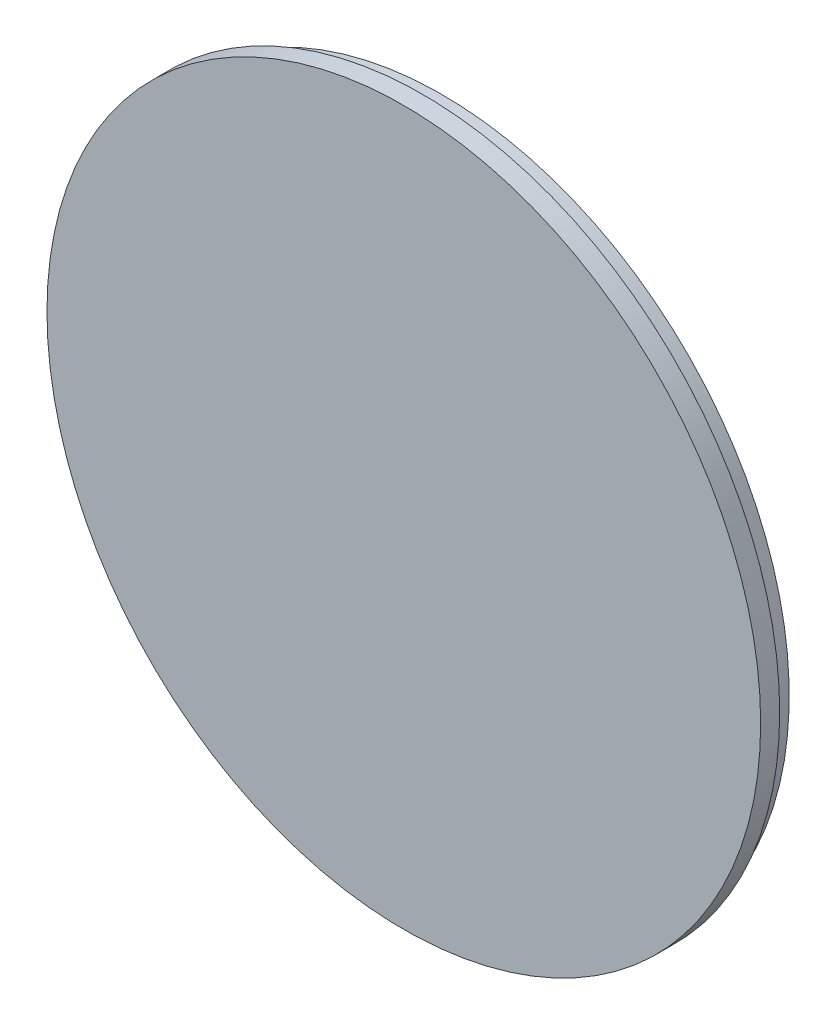
ISO-10303-21;
HEADER;
FILE_DESCRIPTION(('STEP AP214'),'2;1');
FILE_NAME('part.step','',(''),(''),'','','');
FILE_SCHEMA(('AUTOMOTIVE_DESIGN { 1 0 10303 214 1 1 1 1 }'));
ENDSEC;
DATA;
#1=APPLICATION_CONTEXT('core data for automotive mechanical design processes');
#2=APPLICATION_PROTOCOL_DEFINITION('international standard','automotive_design',2000,#1);
#3=PRODUCT_CONTEXT('',#1,'mechanical');
#4=PRODUCT('Part','Part','',(#3));
#5=PRODUCT_RELATED_PRODUCT_CATEGORY('part','',(#4));
#6=PRODUCT_DEFINITION_FORMATION('','',#4);
#7=PRODUCT_DEFINITION_CONTEXT('part definition',#1,'design');
#8=PRODUCT_DEFINITION('design','',#6,#7);
#9=PRODUCT_DEFINITION_SHAPE('','',#8);
#10=(LENGTH_UNIT() NAMED_UNIT(*) SI_UNIT(.MILLI.,.METRE.));
#11=(NAMED_UNIT(*) PLANE_ANGLE_UNIT() SI_UNIT($,.RADIAN.));
#12=(NAMED_UNIT(*) SI_UNIT($,.STERADIAN.) SOLID_ANGLE_UNIT());
#13=UNCERTAINTY_MEASURE_WITH_UNIT(LENGTH_MEASURE(1.E-05),#10,'distance_accuracy_value','');
#14=(GEOMETRIC_REPRESENTATION_CONTEXT(3) GLOBAL_UNCERTAINTY_ASSIGNED_CONTEXT((#13)) GLOBAL_UNIT_ASSIGNED_CONTEXT((#10,
#11,#12)) REPRESENTATION_CONTEXT('',''));
#15=CARTESIAN_POINT('',(0.,0.,0.));
#16=DIRECTION('',(0.,0.,1.));
#17=DIRECTION('',(1.,0.,0.));
#18=AXIS2_PLACEMENT_3D('',#15,#16,#17);
#19=CARTESIAN_POINT('',(0.,0.,1.));
#20=DIRECTION('',(0.,0.,-1.));
#21=DIRECTION('',(-1.,0.,0.));
#22=AXIS2_PLACEMENT_3D('',#19,#20,#21);
#23=CYLINDRICAL_SURFACE('',#22,18.75);
#24=CARTESIAN_POINT('',(0.,0.,1.));
#25=DIRECTION('',(0.,0.,1.));
#26=DIRECTION('',(1.,0.,0.));
#27=AXIS2_PLACEMENT_3D('',#24,#25,#26);
#28=CIRCLE('',#27,18.75);
#29=CARTESIAN_POINT('',(18.75,0.,1.));
#30=VERTEX_POINT('',#29);
#31=EDGE_CURVE('E38',#30,#30,#28,.T.);
#32=ORIENTED_EDGE('',*,*,#31,.F.);
#33=EDGE_LOOP('',(#32));
#34=FACE_BOUND('',#33,.T.);
#35=CARTESIAN_POINT('',(0.,0.,0.));
#36=DIRECTION('',(0.,0.,1.));
#37=DIRECTION('',(1.,0.,0.));
#38=AXIS2_PLACEMENT_3D('',#35,#36,#37);
#39=CIRCLE('',#38,18.75);
#40=CARTESIAN_POINT('',(18.75,0.,0.));
#41=VERTEX_POINT('',#40);
#42=EDGE_CURVE('E34',#41,#41,#39,.T.);
#43=ORIENTED_EDGE('',*,*,#42,.T.);
#44=EDGE_LOOP('',(#43));
#45=FACE_BOUND('',#44,.T.);
#46=ADVANCED_FACE('F31',(#34,#45),#23,.T.);
#47=CARTESIAN_POINT('',(0.,0.,1.));
#48=DIRECTION('',(0.,0.,1.));
#49=DIRECTION('',(1.,0.,0.));
#50=AXIS2_PLACEMENT_3D('',#47,#48,#49);
#51=PLANE('',#50);
#52=ORIENTED_EDGE('',*,*,#31,.T.);
#53=EDGE_LOOP('',(#52));
#54=FACE_BOUND('',#53,.T.);
#55=ADVANCED_FACE('F55',(#54),#51,.T.);
#56=CARTESIAN_POINT('',(0.,0.,0.));
#57=DIRECTION('',(0.,0.,1.));
#58=DIRECTION('',(1.,0.,0.));
#59=AXIS2_PLACEMENT_3D('',#56,#57,#58);
#60=PLANE('',#59);
#61=CARTESIAN_POINT('',(0.,0.,0.));
#62=DIRECTION('',(0.,0.,-1.));
#63=DIRECTION('',(-1.,0.,0.));
#64=AXIS2_PLACEMENT_3D('',#61,#62,#63);
#65=CIRCLE('',#64,18.25);
#66=CARTESIAN_POINT('',(-18.25,0.,0.));
#67=VERTEX_POINT('',#66);
#68=EDGE_CURVE('E10',#67,#67,#65,.T.);
#69=ORIENTED_EDGE('',*,*,#68,.F.);
#70=EDGE_LOOP('',(#69));
#71=FACE_BOUND('',#70,.T.);
#72=ORIENTED_EDGE('',*,*,#42,.F.);
#73=EDGE_LOOP('',(#72));
#74=FACE_BOUND('',#73,.T.);
#75=ADVANCED_FACE('F52',(#71,#74),#60,.F.);
#76=CARTESIAN_POINT('',(0.,0.,-1.));
#77=DIRECTION('',(0.,0.,1.));
#78=DIRECTION('',(1.,0.,0.));
#79=AXIS2_PLACEMENT_3D('',#76,#77,#78);
#80=CYLINDRICAL_SURFACE('',#79,18.25);
#81=CARTESIAN_POINT('',(0.,0.,-1.));
#82=DIRECTION('',(0.,0.,-1.));
#83=DIRECTION('',(-1.,0.,0.));
#84=AXIS2_PLACEMENT_3D('',#81,#82,#83);
#85=CIRCLE('',#84,18.25);
#86=CARTESIAN_POINT('',(-18.25,0.,-1.));
#87=VERTEX_POINT('',#86);
#88=EDGE_CURVE('E44',#87,#87,#85,.T.);
#89=ORIENTED_EDGE('',*,*,#88,.F.);
#90=EDGE_LOOP('',(#89));
#91=FACE_BOUND('',#90,.T.);
#92=ORIENTED_EDGE('',*,*,#68,.T.);
#93=EDGE_LOOP('',(#92));
#94=FACE_BOUND('',#93,.T.);
#95=ADVANCED_FACE('F54',(#91,#94),#80,.T.);
#96=CARTESIAN_POINT('',(0.,0.,-1.));
#97=DIRECTION('',(0.,0.,-1.));
#98=DIRECTION('',(-1.,0.,0.));
#99=AXIS2_PLACEMENT_3D('',#96,#97,#98);
#100=PLANE('',#99);
#101=ORIENTED_EDGE('',*,*,#88,.T.);
#102=EDGE_LOOP('',(#101));
#103=FACE_BOUND('',#102,.T.);
#104=ADVANCED_FACE('F61',(#103),#100,.T.);
#105=CLOSED_SHELL('',(#46,#55,#75,#95,#104));
#106=MANIFOLD_SOLID_BREP('B2',#105);
#107=ADVANCED_BREP_SHAPE_REPRESENTATION('',(#18,#106),#14);
#108=SHAPE_DEFINITION_REPRESENTATION(#9,#107);
ENDSEC;
END-ISO-10303-21;
